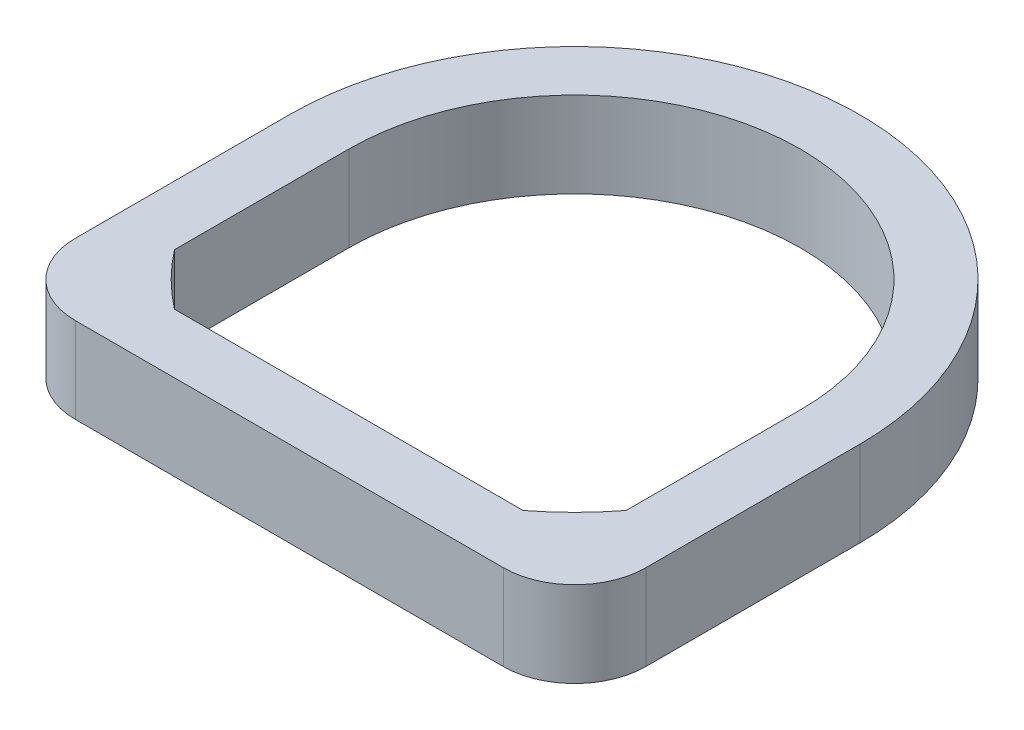
ISO-10303-21;
HEADER;
FILE_DESCRIPTION(('STEP AP214'),'2;1');
FILE_NAME('part.step','',(''),(''),'','','');
FILE_SCHEMA(('AUTOMOTIVE_DESIGN { 1 0 10303 214 1 1 1 1 }'));
ENDSEC;
DATA;
#1=APPLICATION_CONTEXT('core data for automotive mechanical design processes');
#2=APPLICATION_PROTOCOL_DEFINITION('international standard','automotive_design',2000,#1);
#3=PRODUCT_CONTEXT('',#1,'mechanical');
#4=PRODUCT('Part','Part','',(#3));
#5=PRODUCT_RELATED_PRODUCT_CATEGORY('part','',(#4));
#6=PRODUCT_DEFINITION_FORMATION('','',#4);
#7=PRODUCT_DEFINITION_CONTEXT('part definition',#1,'design');
#8=PRODUCT_DEFINITION('design','',#6,#7);
#9=PRODUCT_DEFINITION_SHAPE('','',#8);
#10=(LENGTH_UNIT() NAMED_UNIT(*) SI_UNIT(.MILLI.,.METRE.));
#11=(NAMED_UNIT(*) PLANE_ANGLE_UNIT() SI_UNIT($,.RADIAN.));
#12=(NAMED_UNIT(*) SI_UNIT($,.STERADIAN.) SOLID_ANGLE_UNIT());
#13=UNCERTAINTY_MEASURE_WITH_UNIT(LENGTH_MEASURE(1.E-05),#10,'distance_accuracy_value','');
#14=(GEOMETRIC_REPRESENTATION_CONTEXT(3) GLOBAL_UNCERTAINTY_ASSIGNED_CONTEXT((#13)) GLOBAL_UNIT_ASSIGNED_CONTEXT((#10,
#11,#12)) REPRESENTATION_CONTEXT('',''));
#15=CARTESIAN_POINT('',(0.,0.,0.));
#16=DIRECTION('',(0.,0.,1.));
#17=DIRECTION('',(1.,0.,0.));
#18=AXIS2_PLACEMENT_3D('',#15,#16,#17);
#19=CARTESIAN_POINT('',(0.,3.,10.));
#20=DIRECTION('',(0.,0.,-1.));
#21=DIRECTION('',(-1.,0.,0.));
#22=AXIS2_PLACEMENT_3D('',#19,#20,#21);
#23=PLANE('',#22);
#24=DIRECTION('',(1.,0.,0.));
#25=VECTOR('',#24,1.);
#26=CARTESIAN_POINT('',(0.,0.,10.));
#27=LINE('',#26,#25);
#28=CARTESIAN_POINT('',(-7.5,0.,10.));
#29=VERTEX_POINT('',#28);
#30=CARTESIAN_POINT('',(7.5,0.,10.));
#31=VERTEX_POINT('',#30);
#32=EDGE_CURVE('E213',#29,#31,#27,.T.);
#33=ORIENTED_EDGE('',*,*,#32,.T.);
#34=DIRECTION('',(0.,-1.,0.));
#35=VECTOR('',#34,1.);
#36=CARTESIAN_POINT('',(7.5,3.,10.));
#37=LINE('',#36,#35);
#38=CARTESIAN_POINT('',(7.5,3.,10.));
#39=VERTEX_POINT('',#38);
#40=EDGE_CURVE('E63',#31,#39,#37,.F.);
#41=ORIENTED_EDGE('',*,*,#40,.T.);
#42=DIRECTION('',(1.,0.,0.));
#43=VECTOR('',#42,1.);
#44=CARTESIAN_POINT('',(0.,3.,10.));
#45=LINE('',#44,#43);
#46=CARTESIAN_POINT('',(-7.5,3.,10.));
#47=VERTEX_POINT('',#46);
#48=EDGE_CURVE('E178',#47,#39,#45,.T.);
#49=ORIENTED_EDGE('',*,*,#48,.F.);
#50=DIRECTION('',(0.,-1.,0.));
#51=VECTOR('',#50,1.);
#52=CARTESIAN_POINT('',(-7.5,3.,10.));
#53=LINE('',#52,#51);
#54=EDGE_CURVE('E254',#47,#29,#53,.T.);
#55=ORIENTED_EDGE('',*,*,#54,.T.);
#56=EDGE_LOOP('',(#33,#41,#49,#55));
#57=FACE_BOUND('',#56,.T.);
#58=ADVANCED_FACE('F41',(#57),#23,.F.);
#59=CARTESIAN_POINT('',(10.,3.,0.));
#60=DIRECTION('',(1.,0.,0.));
#61=DIRECTION('',(0.,0.,-1.));
#62=AXIS2_PLACEMENT_3D('',#59,#60,#61);
#63=PLANE('',#62);
#64=DIRECTION('',(0.,0.,1.));
#65=VECTOR('',#64,1.);
#66=CARTESIAN_POINT('',(10.,3.,0.));
#67=LINE('',#66,#65);
#68=CARTESIAN_POINT('',(10.,3.,0.));
#69=VERTEX_POINT('',#68);
#70=CARTESIAN_POINT('',(10.,3.,7.5));
#71=VERTEX_POINT('',#70);
#72=EDGE_CURVE('E181',#69,#71,#67,.T.);
#73=ORIENTED_EDGE('',*,*,#72,.T.);
#74=DIRECTION('',(0.,-1.,0.));
#75=VECTOR('',#74,1.);
#76=CARTESIAN_POINT('',(10.,0.,7.5));
#77=LINE('',#76,#75);
#78=CARTESIAN_POINT('',(10.,0.,7.5));
#79=VERTEX_POINT('',#78);
#80=EDGE_CURVE('E231',#71,#79,#77,.T.);
#81=ORIENTED_EDGE('',*,*,#80,.T.);
#82=DIRECTION('',(0.,0.,1.));
#83=VECTOR('',#82,1.);
#84=CARTESIAN_POINT('',(10.,0.,0.));
#85=LINE('',#84,#83);
#86=CARTESIAN_POINT('',(10.,0.,0.));
#87=VERTEX_POINT('',#86);
#88=EDGE_CURVE('E216',#87,#79,#85,.T.);
#89=ORIENTED_EDGE('',*,*,#88,.F.);
#90=DIRECTION('',(0.,-1.,0.));
#91=VECTOR('',#90,1.);
#92=CARTESIAN_POINT('',(10.,3.,0.));
#93=LINE('',#92,#91);
#94=EDGE_CURVE('E228',#69,#87,#93,.T.);
#95=ORIENTED_EDGE('',*,*,#94,.F.);
#96=EDGE_LOOP('',(#73,#81,#89,#95));
#97=FACE_BOUND('',#96,.T.);
#98=ADVANCED_FACE('F268',(#97),#63,.T.);
#99=CARTESIAN_POINT('',(0.,3.,0.));
#100=DIRECTION('',(0.,-1.,0.));
#101=DIRECTION('',(0.,0.,-1.));
#102=AXIS2_PLACEMENT_3D('',#99,#100,#101);
#103=CYLINDRICAL_SURFACE('',#102,10.);
#104=CARTESIAN_POINT('',(0.,0.,0.));
#105=DIRECTION('',(0.,1.,0.));
#106=DIRECTION('',(0.,0.,1.));
#107=AXIS2_PLACEMENT_3D('',#104,#105,#106);
#108=CIRCLE('',#107,10.);
#109=CARTESIAN_POINT('',(-10.,0.,0.));
#110=VERTEX_POINT('',#109);
#111=EDGE_CURVE('E220',#87,#110,#108,.T.);
#112=ORIENTED_EDGE('',*,*,#111,.T.);
#113=DIRECTION('',(0.,-1.,0.));
#114=VECTOR('',#113,1.);
#115=CARTESIAN_POINT('',(-10.,3.,0.));
#116=LINE('',#115,#114);
#117=CARTESIAN_POINT('',(-10.,3.,0.));
#118=VERTEX_POINT('',#117);
#119=EDGE_CURVE('E158',#118,#110,#116,.T.);
#120=ORIENTED_EDGE('',*,*,#119,.F.);
#121=CARTESIAN_POINT('',(0.,3.,0.));
#122=DIRECTION('',(0.,1.,0.));
#123=DIRECTION('',(0.,0.,1.));
#124=AXIS2_PLACEMENT_3D('',#121,#122,#123);
#125=CIRCLE('',#124,10.);
#126=EDGE_CURVE('E185',#69,#118,#125,.T.);
#127=ORIENTED_EDGE('',*,*,#126,.F.);
#128=ORIENTED_EDGE('',*,*,#94,.T.);
#129=EDGE_LOOP('',(#112,#120,#127,#128));
#130=FACE_BOUND('',#129,.T.);
#131=ADVANCED_FACE('F283',(#130),#103,.T.);
#132=CARTESIAN_POINT('',(7.91645419234044,3.,0.));
#133=DIRECTION('',(1.,0.,0.));
#134=DIRECTION('',(0.,0.,-1.));
#135=AXIS2_PLACEMENT_3D('',#132,#133,#134);
#136=PLANE('',#135);
#137=DIRECTION('',(0.,0.,1.));
#138=VECTOR('',#137,1.);
#139=CARTESIAN_POINT('',(7.91645419234044,0.,0.));
#140=LINE('',#139,#138);
#141=CARTESIAN_POINT('',(7.91645419234044,0.,0.));
#142=VERTEX_POINT('',#141);
#143=CARTESIAN_POINT('',(7.91645419234044,0.,6.10980793647194));
#144=VERTEX_POINT('',#143);
#145=EDGE_CURVE('E153',#142,#144,#140,.T.);
#146=ORIENTED_EDGE('',*,*,#145,.T.);
#147=DIRECTION('',(0.,-1.,0.));
#148=VECTOR('',#147,1.);
#149=CARTESIAN_POINT('',(7.91645419234044,3.,6.10980793647194));
#150=LINE('',#149,#148);
#151=CARTESIAN_POINT('',(7.91645419234044,3.,6.10980793647194));
#152=VERTEX_POINT('',#151);
#153=EDGE_CURVE('E150',#152,#144,#150,.T.);
#154=ORIENTED_EDGE('',*,*,#153,.F.);
#155=DIRECTION('',(0.,0.,1.));
#156=VECTOR('',#155,1.);
#157=CARTESIAN_POINT('',(7.91645419234044,3.,0.));
#158=LINE('',#157,#156);
#159=CARTESIAN_POINT('',(7.91645419234044,3.,0.));
#160=VERTEX_POINT('',#159);
#161=EDGE_CURVE('E134',#160,#152,#158,.T.);
#162=ORIENTED_EDGE('',*,*,#161,.F.);
#163=DIRECTION('',(0.,-1.,0.));
#164=VECTOR('',#163,1.);
#165=CARTESIAN_POINT('',(7.91645419234044,3.,0.));
#166=LINE('',#165,#164);
#167=EDGE_CURVE('E191',#160,#142,#166,.T.);
#168=ORIENTED_EDGE('',*,*,#167,.T.);
#169=EDGE_LOOP('',(#146,#154,#162,#168));
#170=FACE_BOUND('',#169,.T.);
#171=ADVANCED_FACE('F151',(#170),#136,.F.);
#172=CARTESIAN_POINT('',(0.,3.,0.));
#173=DIRECTION('',(0.,-1.,0.));
#174=DIRECTION('',(0.,0.,-1.));
#175=AXIS2_PLACEMENT_3D('',#172,#173,#174);
#176=CYLINDRICAL_SURFACE('',#175,10.);
#177=CARTESIAN_POINT('',(0.,0.,0.));
#178=DIRECTION('',(0.,1.,0.));
#179=DIRECTION('',(0.,0.,1.));
#180=AXIS2_PLACEMENT_3D('',#177,#178,#179);
#181=CIRCLE('',#180,10.);
#182=CARTESIAN_POINT('',(6.10980793647194,0.,7.91645419234044));
#183=VERTEX_POINT('',#182);
#184=EDGE_CURVE('E194',#183,#144,#181,.T.);
#185=ORIENTED_EDGE('',*,*,#184,.F.);
#186=DIRECTION('',(0.,-1.,0.));
#187=VECTOR('',#186,1.);
#188=CARTESIAN_POINT('',(6.10980793647194,3.,7.91645419234044));
#189=LINE('',#188,#187);
#190=CARTESIAN_POINT('',(6.10980793647194,3.,7.91645419234044));
#191=VERTEX_POINT('',#190);
#192=EDGE_CURVE('E159',#191,#183,#189,.T.);
#193=ORIENTED_EDGE('',*,*,#192,.F.);
#194=CARTESIAN_POINT('',(0.,3.,0.));
#195=DIRECTION('',(0.,1.,0.));
#196=DIRECTION('',(0.,0.,1.));
#197=AXIS2_PLACEMENT_3D('',#194,#195,#196);
#198=CIRCLE('',#197,10.);
#199=EDGE_CURVE('E140',#191,#152,#198,.T.);
#200=ORIENTED_EDGE('',*,*,#199,.T.);
#201=ORIENTED_EDGE('',*,*,#153,.T.);
#202=EDGE_LOOP('',(#185,#193,#200,#201));
#203=FACE_BOUND('',#202,.T.);
#204=ADVANCED_FACE('F161',(#203),#176,.F.);
#205=CARTESIAN_POINT('',(0.,3.,7.91645419234044));
#206=DIRECTION('',(0.,0.,-1.));
#207=DIRECTION('',(-1.,0.,0.));
#208=AXIS2_PLACEMENT_3D('',#205,#206,#207);
#209=PLANE('',#208);
#210=DIRECTION('',(1.,0.,0.));
#211=VECTOR('',#210,1.);
#212=CARTESIAN_POINT('',(0.,0.,7.91645419234044));
#213=LINE('',#212,#211);
#214=CARTESIAN_POINT('',(-6.10980793647194,0.,7.91645419234044));
#215=VERTEX_POINT('',#214);
#216=EDGE_CURVE('E197',#215,#183,#213,.T.);
#217=ORIENTED_EDGE('',*,*,#216,.F.);
#218=DIRECTION('',(0.,-1.,0.));
#219=VECTOR('',#218,1.);
#220=CARTESIAN_POINT('',(-6.10980793647194,3.,7.91645419234044));
#221=LINE('',#220,#219);
#222=CARTESIAN_POINT('',(-6.10980793647194,3.,7.91645419234044));
#223=VERTEX_POINT('',#222);
#224=EDGE_CURVE('E240',#223,#215,#221,.T.);
#225=ORIENTED_EDGE('',*,*,#224,.F.);
#226=DIRECTION('',(1.,0.,0.));
#227=VECTOR('',#226,1.);
#228=CARTESIAN_POINT('',(0.,3.,7.91645419234044));
#229=LINE('',#228,#227);
#230=EDGE_CURVE('E163',#223,#191,#229,.T.);
#231=ORIENTED_EDGE('',*,*,#230,.T.);
#232=ORIENTED_EDGE('',*,*,#192,.T.);
#233=EDGE_LOOP('',(#217,#225,#231,#232));
#234=FACE_BOUND('',#233,.T.);
#235=ADVANCED_FACE('F309',(#234),#209,.T.);
#236=CARTESIAN_POINT('',(0.,3.,0.));
#237=DIRECTION('',(0.,-1.,0.));
#238=DIRECTION('',(0.,0.,-1.));
#239=AXIS2_PLACEMENT_3D('',#236,#237,#238);
#240=CYLINDRICAL_SURFACE('',#239,10.);
#241=CARTESIAN_POINT('',(0.,0.,0.));
#242=DIRECTION('',(0.,1.,0.));
#243=DIRECTION('',(0.,0.,1.));
#244=AXIS2_PLACEMENT_3D('',#241,#242,#243);
#245=CIRCLE('',#244,10.);
#246=CARTESIAN_POINT('',(-7.91645419234044,0.,6.10980793647194));
#247=VERTEX_POINT('',#246);
#248=EDGE_CURVE('E201',#247,#215,#245,.T.);
#249=ORIENTED_EDGE('',*,*,#248,.F.);
#250=DIRECTION('',(0.,-1.,0.));
#251=VECTOR('',#250,1.);
#252=CARTESIAN_POINT('',(-7.91645419234044,3.,6.10980793647194));
#253=LINE('',#252,#251);
#254=CARTESIAN_POINT('',(-7.91645419234044,3.,6.10980793647194));
#255=VERTEX_POINT('',#254);
#256=EDGE_CURVE('E237',#255,#247,#253,.T.);
#257=ORIENTED_EDGE('',*,*,#256,.F.);
#258=CARTESIAN_POINT('',(0.,3.,0.));
#259=DIRECTION('',(0.,1.,0.));
#260=DIRECTION('',(0.,0.,1.));
#261=AXIS2_PLACEMENT_3D('',#258,#259,#260);
#262=CIRCLE('',#261,10.);
#263=EDGE_CURVE('E166',#255,#223,#262,.T.);
#264=ORIENTED_EDGE('',*,*,#263,.T.);
#265=ORIENTED_EDGE('',*,*,#224,.T.);
#266=EDGE_LOOP('',(#249,#257,#264,#265));
#267=FACE_BOUND('',#266,.T.);
#268=ADVANCED_FACE('F305',(#267),#240,.F.);
#269=CARTESIAN_POINT('',(-7.91645419234044,3.,0.));
#270=DIRECTION('',(1.,0.,0.));
#271=DIRECTION('',(0.,0.,-1.));
#272=AXIS2_PLACEMENT_3D('',#269,#270,#271);
#273=PLANE('',#272);
#274=DIRECTION('',(0.,0.,1.));
#275=VECTOR('',#274,1.);
#276=CARTESIAN_POINT('',(-7.91645419234044,0.,0.));
#277=LINE('',#276,#275);
#278=CARTESIAN_POINT('',(-7.91645419234044,0.,0.));
#279=VERTEX_POINT('',#278);
#280=EDGE_CURVE('E205',#279,#247,#277,.T.);
#281=ORIENTED_EDGE('',*,*,#280,.F.);
#282=DIRECTION('',(0.,-1.,0.));
#283=VECTOR('',#282,1.);
#284=CARTESIAN_POINT('',(-7.91645419234044,3.,0.));
#285=LINE('',#284,#283);
#286=CARTESIAN_POINT('',(-7.91645419234044,3.,0.));
#287=VERTEX_POINT('',#286);
#288=EDGE_CURVE('E234',#287,#279,#285,.T.);
#289=ORIENTED_EDGE('',*,*,#288,.F.);
#290=DIRECTION('',(0.,0.,1.));
#291=VECTOR('',#290,1.);
#292=CARTESIAN_POINT('',(-7.91645419234044,3.,0.));
#293=LINE('',#292,#291);
#294=EDGE_CURVE('E172',#287,#255,#293,.T.);
#295=ORIENTED_EDGE('',*,*,#294,.T.);
#296=ORIENTED_EDGE('',*,*,#256,.T.);
#297=EDGE_LOOP('',(#281,#289,#295,#296));
#298=FACE_BOUND('',#297,.T.);
#299=ADVANCED_FACE('F301',(#298),#273,.T.);
#300=CARTESIAN_POINT('',(0.,3.,0.));
#301=DIRECTION('',(0.,-1.,0.));
#302=DIRECTION('',(0.,0.,-1.));
#303=AXIS2_PLACEMENT_3D('',#300,#301,#302);
#304=CYLINDRICAL_SURFACE('',#303,7.91645419234044);
#305=CARTESIAN_POINT('',(0.,0.,0.));
#306=DIRECTION('',(0.,1.,0.));
#307=DIRECTION('',(0.,0.,1.));
#308=AXIS2_PLACEMENT_3D('',#305,#306,#307);
#309=CIRCLE('',#308,7.91645419234044);
#310=EDGE_CURVE('E209',#142,#279,#309,.T.);
#311=ORIENTED_EDGE('',*,*,#310,.F.);
#312=ORIENTED_EDGE('',*,*,#167,.F.);
#313=CARTESIAN_POINT('',(0.,3.,0.));
#314=DIRECTION('',(0.,1.,0.));
#315=DIRECTION('',(0.,0.,1.));
#316=AXIS2_PLACEMENT_3D('',#313,#314,#315);
#317=CIRCLE('',#316,7.91645419234044);
#318=EDGE_CURVE('E144',#160,#287,#317,.T.);
#319=ORIENTED_EDGE('',*,*,#318,.T.);
#320=ORIENTED_EDGE('',*,*,#288,.T.);
#321=EDGE_LOOP('',(#311,#312,#319,#320));
#322=FACE_BOUND('',#321,.T.);
#323=ADVANCED_FACE('F298',(#322),#304,.F.);
#324=CARTESIAN_POINT('',(-10.,3.,0.));
#325=DIRECTION('',(1.,0.,0.));
#326=DIRECTION('',(0.,0.,-1.));
#327=AXIS2_PLACEMENT_3D('',#324,#325,#326);
#328=PLANE('',#327);
#329=DIRECTION('',(0.,0.,1.));
#330=VECTOR('',#329,1.);
#331=CARTESIAN_POINT('',(-10.,0.,0.));
#332=LINE('',#331,#330);
#333=CARTESIAN_POINT('',(-10.,0.,7.5));
#334=VERTEX_POINT('',#333);
#335=EDGE_CURVE('E147',#110,#334,#332,.T.);
#336=ORIENTED_EDGE('',*,*,#335,.T.);
#337=DIRECTION('',(0.,-1.,0.));
#338=VECTOR('',#337,1.);
#339=CARTESIAN_POINT('',(-10.,3.,7.5));
#340=LINE('',#339,#338);
#341=CARTESIAN_POINT('',(-10.,3.,7.5));
#342=VERTEX_POINT('',#341);
#343=EDGE_CURVE('E11',#334,#342,#340,.F.);
#344=ORIENTED_EDGE('',*,*,#343,.T.);
#345=DIRECTION('',(0.,0.,1.));
#346=VECTOR('',#345,1.);
#347=CARTESIAN_POINT('',(-10.,3.,0.));
#348=LINE('',#347,#346);
#349=EDGE_CURVE('E188',#118,#342,#348,.T.);
#350=ORIENTED_EDGE('',*,*,#349,.F.);
#351=ORIENTED_EDGE('',*,*,#119,.T.);
#352=EDGE_LOOP('',(#336,#344,#350,#351));
#353=FACE_BOUND('',#352,.T.);
#354=ADVANCED_FACE('F280',(#353),#328,.F.);
#355=CARTESIAN_POINT('',(0.,3.,0.));
#356=DIRECTION('',(0.,1.,0.));
#357=DIRECTION('',(0.,0.,1.));
#358=AXIS2_PLACEMENT_3D('',#355,#356,#357);
#359=PLANE('',#358);
#360=ORIENTED_EDGE('',*,*,#161,.T.);
#361=ORIENTED_EDGE('',*,*,#199,.F.);
#362=ORIENTED_EDGE('',*,*,#230,.F.);
#363=ORIENTED_EDGE('',*,*,#263,.F.);
#364=ORIENTED_EDGE('',*,*,#294,.F.);
#365=ORIENTED_EDGE('',*,*,#318,.F.);
#366=EDGE_LOOP('',(#360,#361,#362,#363,#364,#365));
#367=FACE_BOUND('',#366,.T.);
#368=ORIENTED_EDGE('',*,*,#48,.T.);
#369=CARTESIAN_POINT('',(7.5,3.,7.5));
#370=DIRECTION('',(0.,1.,0.));
#371=DIRECTION('',(0.,0.,1.));
#372=AXIS2_PLACEMENT_3D('',#369,#370,#371);
#373=CIRCLE('',#372,2.5);
#374=EDGE_CURVE('E50',#39,#71,#373,.T.);
#375=ORIENTED_EDGE('',*,*,#374,.T.);
#376=ORIENTED_EDGE('',*,*,#72,.F.);
#377=ORIENTED_EDGE('',*,*,#126,.T.);
#378=ORIENTED_EDGE('',*,*,#349,.T.);
#379=CARTESIAN_POINT('',(-7.5,3.,7.5));
#380=DIRECTION('',(0.,1.,0.));
#381=DIRECTION('',(0.,0.,1.));
#382=AXIS2_PLACEMENT_3D('',#379,#380,#381);
#383=CIRCLE('',#382,2.5);
#384=EDGE_CURVE('E260',#342,#47,#383,.T.);
#385=ORIENTED_EDGE('',*,*,#384,.T.);
#386=EDGE_LOOP('',(#368,#375,#376,#377,#378,#385));
#387=FACE_BOUND('',#386,.T.);
#388=ADVANCED_FACE('F136',(#367,#387),#359,.T.);
#389=CARTESIAN_POINT('',(0.,0.,0.));
#390=DIRECTION('',(0.,1.,0.));
#391=DIRECTION('',(0.,0.,1.));
#392=AXIS2_PLACEMENT_3D('',#389,#390,#391);
#393=PLANE('',#392);
#394=ORIENTED_EDGE('',*,*,#145,.F.);
#395=ORIENTED_EDGE('',*,*,#310,.T.);
#396=ORIENTED_EDGE('',*,*,#280,.T.);
#397=ORIENTED_EDGE('',*,*,#248,.T.);
#398=ORIENTED_EDGE('',*,*,#216,.T.);
#399=ORIENTED_EDGE('',*,*,#184,.T.);
#400=EDGE_LOOP('',(#394,#395,#396,#397,#398,#399));
#401=FACE_BOUND('',#400,.T.);
#402=ORIENTED_EDGE('',*,*,#88,.T.);
#403=CARTESIAN_POINT('',(7.5,0.,7.5));
#404=DIRECTION('',(0.,1.,0.));
#405=DIRECTION('',(0.,0.,1.));
#406=AXIS2_PLACEMENT_3D('',#403,#404,#405);
#407=CIRCLE('',#406,2.5);
#408=EDGE_CURVE('E251',#79,#31,#407,.F.);
#409=ORIENTED_EDGE('',*,*,#408,.T.);
#410=ORIENTED_EDGE('',*,*,#32,.F.);
#411=CARTESIAN_POINT('',(-7.5,0.,7.5));
#412=DIRECTION('',(0.,1.,0.));
#413=DIRECTION('',(0.,0.,1.));
#414=AXIS2_PLACEMENT_3D('',#411,#412,#413);
#415=CIRCLE('',#414,2.5);
#416=EDGE_CURVE('E248',#29,#334,#415,.F.);
#417=ORIENTED_EDGE('',*,*,#416,.T.);
#418=ORIENTED_EDGE('',*,*,#335,.F.);
#419=ORIENTED_EDGE('',*,*,#111,.F.);
#420=EDGE_LOOP('',(#402,#409,#410,#417,#418,#419));
#421=FACE_BOUND('',#420,.T.);
#422=ADVANCED_FACE('F274',(#401,#421),#393,.F.);
#423=CARTESIAN_POINT('',(7.5,3.,7.5));
#424=DIRECTION('',(0.,1.,0.));
#425=DIRECTION('',(0.,0.,1.));
#426=AXIS2_PLACEMENT_3D('',#423,#424,#425);
#427=CYLINDRICAL_SURFACE('',#426,2.5);
#428=ORIENTED_EDGE('',*,*,#374,.F.);
#429=ORIENTED_EDGE('',*,*,#40,.F.);
#430=ORIENTED_EDGE('',*,*,#408,.F.);
#431=ORIENTED_EDGE('',*,*,#80,.F.);
#432=EDGE_LOOP('',(#428,#429,#430,#431));
#433=FACE_BOUND('',#432,.T.);
#434=ADVANCED_FACE('F271',(#433),#427,.T.);
#435=CARTESIAN_POINT('',(-7.5,3.,7.5));
#436=DIRECTION('',(0.,-1.,0.));
#437=DIRECTION('',(0.,0.,-1.));
#438=AXIS2_PLACEMENT_3D('',#435,#436,#437);
#439=CYLINDRICAL_SURFACE('',#438,2.5);
#440=ORIENTED_EDGE('',*,*,#384,.F.);
#441=ORIENTED_EDGE('',*,*,#343,.F.);
#442=ORIENTED_EDGE('',*,*,#416,.F.);
#443=ORIENTED_EDGE('',*,*,#54,.F.);
#444=EDGE_LOOP('',(#440,#441,#442,#443));
#445=FACE_BOUND('',#444,.T.);
#446=ADVANCED_FACE('F43',(#445),#439,.T.);
#447=CLOSED_SHELL('',(#58,#98,#131,#171,#204,#235,#268,#299,#323,#354,#388,#422,#434,#446));
#448=MANIFOLD_SOLID_BREP('B2',#447);
#449=ADVANCED_BREP_SHAPE_REPRESENTATION('',(#18,#448),#14);
#450=SHAPE_DEFINITION_REPRESENTATION(#9,#449);
ENDSEC;
END-ISO-10303-21;
